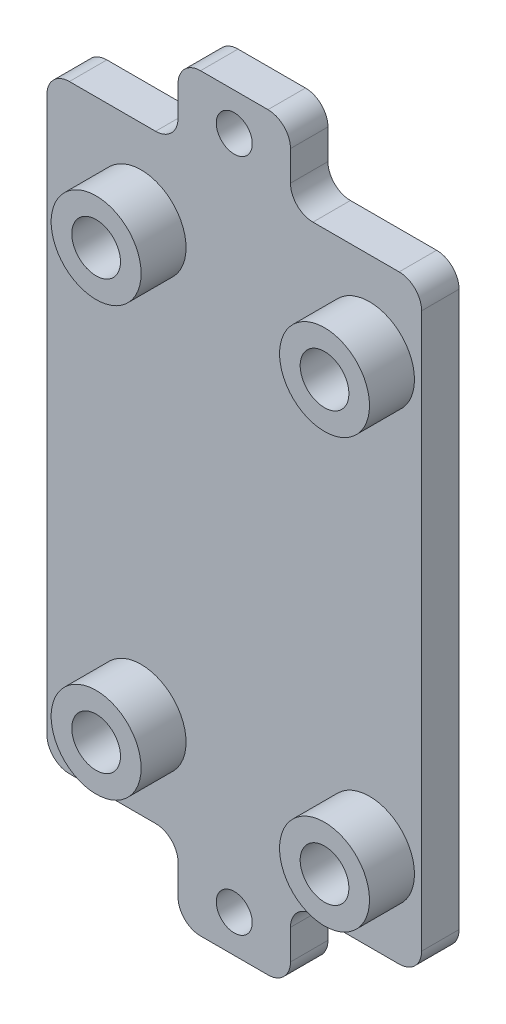
ISO-10303-21;
HEADER;
FILE_DESCRIPTION(('STEP AP214'),'2;1');
FILE_NAME('part.step','',(''),(''),'','','');
FILE_SCHEMA(('AUTOMOTIVE_DESIGN { 1 0 10303 214 1 1 1 1 }'));
ENDSEC;
DATA;
#1=APPLICATION_CONTEXT('core data for automotive mechanical design processes');
#2=APPLICATION_PROTOCOL_DEFINITION('international standard','automotive_design',2000,#1);
#3=PRODUCT_CONTEXT('',#1,'mechanical');
#4=PRODUCT('Part','Part','',(#3));
#5=PRODUCT_RELATED_PRODUCT_CATEGORY('part','',(#4));
#6=PRODUCT_DEFINITION_FORMATION('','',#4);
#7=PRODUCT_DEFINITION_CONTEXT('part definition',#1,'design');
#8=PRODUCT_DEFINITION('design','',#6,#7);
#9=PRODUCT_DEFINITION_SHAPE('','',#8);
#10=(LENGTH_UNIT() NAMED_UNIT(*) SI_UNIT(.MILLI.,.METRE.));
#11=(NAMED_UNIT(*) PLANE_ANGLE_UNIT() SI_UNIT($,.RADIAN.));
#12=(NAMED_UNIT(*) SI_UNIT($,.STERADIAN.) SOLID_ANGLE_UNIT());
#13=UNCERTAINTY_MEASURE_WITH_UNIT(LENGTH_MEASURE(1.E-05),#10,'distance_accuracy_value','');
#14=(GEOMETRIC_REPRESENTATION_CONTEXT(3) GLOBAL_UNCERTAINTY_ASSIGNED_CONTEXT((#13)) GLOBAL_UNIT_ASSIGNED_CONTEXT((#10,
#11,#12)) REPRESENTATION_CONTEXT('',''));
#15=CARTESIAN_POINT('',(0.,0.,0.));
#16=DIRECTION('',(0.,0.,1.));
#17=DIRECTION('',(1.,0.,0.));
#18=AXIS2_PLACEMENT_3D('',#15,#16,#17);
#19=CARTESIAN_POINT('',(-25.,-40.,5.));
#20=DIRECTION('',(0.,1.,0.));
#21=DIRECTION('',(0.,0.,1.));
#22=AXIS2_PLACEMENT_3D('',#19,#20,#21);
#23=PLANE('',#22);
#24=DIRECTION('',(1.,0.,0.));
#25=VECTOR('',#24,1.);
#26=CARTESIAN_POINT('',(-25.,-40.,0.));
#27=LINE('',#26,#25);
#28=CARTESIAN_POINT('',(10.5,-40.,0.));
#29=VERTEX_POINT('',#28);
#30=CARTESIAN_POINT('',(22.,-40.,0.));
#31=VERTEX_POINT('',#30);
#32=EDGE_CURVE('E335',#29,#31,#27,.T.);
#33=ORIENTED_EDGE('',*,*,#32,.T.);
#34=DIRECTION('',(0.,0.,-1.));
#35=VECTOR('',#34,1.);
#36=CARTESIAN_POINT('',(22.,-40.,5.));
#37=LINE('',#36,#35);
#38=CARTESIAN_POINT('',(22.,-40.,5.));
#39=VERTEX_POINT('',#38);
#40=EDGE_CURVE('E63',#31,#39,#37,.F.);
#41=ORIENTED_EDGE('',*,*,#40,.T.);
#42=DIRECTION('',(1.,0.,0.));
#43=VECTOR('',#42,1.);
#44=CARTESIAN_POINT('',(-25.,-40.,5.));
#45=LINE('',#44,#43);
#46=CARTESIAN_POINT('',(10.5,-40.,5.));
#47=VERTEX_POINT('',#46);
#48=EDGE_CURVE('E319',#47,#39,#45,.T.);
#49=ORIENTED_EDGE('',*,*,#48,.F.);
#50=DIRECTION('',(0.,0.,1.));
#51=VECTOR('',#50,1.);
#52=CARTESIAN_POINT('',(10.5,-40.,0.));
#53=LINE('',#52,#51);
#54=EDGE_CURVE('E444',#47,#29,#53,.F.);
#55=ORIENTED_EDGE('',*,*,#54,.T.);
#56=EDGE_LOOP('',(#33,#41,#49,#55));
#57=FACE_BOUND('',#56,.T.);
#58=ADVANCED_FACE('F47',(#57),#23,.F.);
#59=CARTESIAN_POINT('',(-25.,40.,5.));
#60=DIRECTION('',(0.,-1.,0.));
#61=DIRECTION('',(0.,0.,-1.));
#62=AXIS2_PLACEMENT_3D('',#59,#60,#61);
#63=PLANE('',#62);
#64=DIRECTION('',(-1.,0.,0.));
#65=VECTOR('',#64,1.);
#66=CARTESIAN_POINT('',(-25.,40.,5.));
#67=LINE('',#66,#65);
#68=CARTESIAN_POINT('',(-10.5,40.,5.));
#69=VERTEX_POINT('',#68);
#70=CARTESIAN_POINT('',(-22.,40.,5.));
#71=VERTEX_POINT('',#70);
#72=EDGE_CURVE('E309',#69,#71,#67,.T.);
#73=ORIENTED_EDGE('',*,*,#72,.F.);
#74=DIRECTION('',(0.,0.,1.));
#75=VECTOR('',#74,1.);
#76=CARTESIAN_POINT('',(-10.5,40.,0.));
#77=LINE('',#76,#75);
#78=CARTESIAN_POINT('',(-10.5,40.,0.));
#79=VERTEX_POINT('',#78);
#80=EDGE_CURVE('E214',#69,#79,#77,.F.);
#81=ORIENTED_EDGE('',*,*,#80,.T.);
#82=DIRECTION('',(-1.,0.,0.));
#83=VECTOR('',#82,1.);
#84=CARTESIAN_POINT('',(-25.,40.,0.));
#85=LINE('',#84,#83);
#86=CARTESIAN_POINT('',(-22.,40.,0.));
#87=VERTEX_POINT('',#86);
#88=EDGE_CURVE('E326',#79,#87,#85,.T.);
#89=ORIENTED_EDGE('',*,*,#88,.T.);
#90=DIRECTION('',(0.,0.,-1.));
#91=VECTOR('',#90,1.);
#92=CARTESIAN_POINT('',(-22.,40.,5.));
#93=LINE('',#92,#91);
#94=EDGE_CURVE('E231',#87,#71,#93,.F.);
#95=ORIENTED_EDGE('',*,*,#94,.T.);
#96=EDGE_LOOP('',(#73,#81,#89,#95));
#97=FACE_BOUND('',#96,.T.);
#98=ADVANCED_FACE('F531',(#97),#63,.F.);
#99=CARTESIAN_POINT('',(25.,40.,5.));
#100=DIRECTION('',(-1.,0.,0.));
#101=DIRECTION('',(0.,-1.,0.));
#102=AXIS2_PLACEMENT_3D('',#99,#100,#101);
#103=PLANE('',#102);
#104=DIRECTION('',(0.,1.,0.));
#105=VECTOR('',#104,1.);
#106=CARTESIAN_POINT('',(25.,40.,0.));
#107=LINE('',#106,#105);
#108=CARTESIAN_POINT('',(25.,-37.,0.));
#109=VERTEX_POINT('',#108);
#110=CARTESIAN_POINT('',(25.,37.,0.));
#111=VERTEX_POINT('',#110);
#112=EDGE_CURVE('E301',#109,#111,#107,.T.);
#113=ORIENTED_EDGE('',*,*,#112,.T.);
#114=DIRECTION('',(0.,0.,-1.));
#115=VECTOR('',#114,1.);
#116=CARTESIAN_POINT('',(25.,37.,5.));
#117=LINE('',#116,#115);
#118=CARTESIAN_POINT('',(25.,37.,5.));
#119=VERTEX_POINT('',#118);
#120=EDGE_CURVE('E441',#111,#119,#117,.F.);
#121=ORIENTED_EDGE('',*,*,#120,.T.);
#122=DIRECTION('',(0.,1.,0.));
#123=VECTOR('',#122,1.);
#124=CARTESIAN_POINT('',(25.,40.,5.));
#125=LINE('',#124,#123);
#126=CARTESIAN_POINT('',(25.,-37.,5.));
#127=VERTEX_POINT('',#126);
#128=EDGE_CURVE('E305',#127,#119,#125,.T.);
#129=ORIENTED_EDGE('',*,*,#128,.F.);
#130=DIRECTION('',(0.,0.,-1.));
#131=VECTOR('',#130,1.);
#132=CARTESIAN_POINT('',(25.,-37.,5.));
#133=LINE('',#132,#131);
#134=EDGE_CURVE('E437',#127,#109,#133,.T.);
#135=ORIENTED_EDGE('',*,*,#134,.T.);
#136=EDGE_LOOP('',(#113,#121,#129,#135));
#137=FACE_BOUND('',#136,.T.);
#138=ADVANCED_FACE('F608',(#137),#103,.F.);
#139=CARTESIAN_POINT('',(22.,40.,0.));
#140=VERTEX_POINT('',#139);
#141=CARTESIAN_POINT('',(10.5,40.,0.));
#142=VERTEX_POINT('',#141);
#143=EDGE_CURVE('E327',#140,#142,#85,.T.);
#144=ORIENTED_EDGE('',*,*,#143,.T.);
#145=DIRECTION('',(0.,0.,1.));
#146=VECTOR('',#145,1.);
#147=CARTESIAN_POINT('',(10.5,40.,5.));
#148=LINE('',#147,#146);
#149=CARTESIAN_POINT('',(10.5,40.,5.));
#150=VERTEX_POINT('',#149);
#151=EDGE_CURVE('E433',#142,#150,#148,.T.);
#152=ORIENTED_EDGE('',*,*,#151,.T.);
#153=CARTESIAN_POINT('',(22.,40.,5.));
#154=VERTEX_POINT('',#153);
#155=EDGE_CURVE('E311',#154,#150,#67,.T.);
#156=ORIENTED_EDGE('',*,*,#155,.F.);
#157=DIRECTION('',(0.,0.,-1.));
#158=VECTOR('',#157,1.);
#159=CARTESIAN_POINT('',(22.,40.,5.));
#160=LINE('',#159,#158);
#161=EDGE_CURVE('E429',#154,#140,#160,.T.);
#162=ORIENTED_EDGE('',*,*,#161,.T.);
#163=EDGE_LOOP('',(#144,#152,#156,#162));
#164=FACE_BOUND('',#163,.T.);
#165=ADVANCED_FACE('F610',(#164),#63,.F.);
#166=CARTESIAN_POINT('',(-25.,40.,5.));
#167=DIRECTION('',(1.,0.,0.));
#168=DIRECTION('',(0.,0.,-1.));
#169=AXIS2_PLACEMENT_3D('',#166,#167,#168);
#170=PLANE('',#169);
#171=DIRECTION('',(0.,-1.,0.));
#172=VECTOR('',#171,1.);
#173=CARTESIAN_POINT('',(-25.,40.,5.));
#174=LINE('',#173,#172);
#175=CARTESIAN_POINT('',(-25.,37.,5.));
#176=VERTEX_POINT('',#175);
#177=CARTESIAN_POINT('',(-25.,-37.,5.));
#178=VERTEX_POINT('',#177);
#179=EDGE_CURVE('E315',#176,#178,#174,.T.);
#180=ORIENTED_EDGE('',*,*,#179,.F.);
#181=DIRECTION('',(0.,0.,-1.));
#182=VECTOR('',#181,1.);
#183=CARTESIAN_POINT('',(-25.,37.,5.));
#184=LINE('',#183,#182);
#185=CARTESIAN_POINT('',(-25.,37.,0.));
#186=VERTEX_POINT('',#185);
#187=EDGE_CURVE('E364',#176,#186,#184,.T.);
#188=ORIENTED_EDGE('',*,*,#187,.T.);
#189=DIRECTION('',(0.,-1.,0.));
#190=VECTOR('',#189,1.);
#191=CARTESIAN_POINT('',(-25.,40.,0.));
#192=LINE('',#191,#190);
#193=CARTESIAN_POINT('',(-25.,-37.,0.));
#194=VERTEX_POINT('',#193);
#195=EDGE_CURVE('E331',#186,#194,#192,.T.);
#196=ORIENTED_EDGE('',*,*,#195,.T.);
#197=DIRECTION('',(0.,0.,-1.));
#198=VECTOR('',#197,1.);
#199=CARTESIAN_POINT('',(-25.,-37.,5.));
#200=LINE('',#199,#198);
#201=EDGE_CURVE('E361',#194,#178,#200,.F.);
#202=ORIENTED_EDGE('',*,*,#201,.T.);
#203=EDGE_LOOP('',(#180,#188,#196,#202));
#204=FACE_BOUND('',#203,.T.);
#205=ADVANCED_FACE('F522',(#204),#170,.F.);
#206=CARTESIAN_POINT('',(-22.,-40.,0.));
#207=VERTEX_POINT('',#206);
#208=CARTESIAN_POINT('',(-10.5,-40.,0.));
#209=VERTEX_POINT('',#208);
#210=EDGE_CURVE('E310',#207,#209,#27,.T.);
#211=ORIENTED_EDGE('',*,*,#210,.T.);
#212=DIRECTION('',(0.,0.,1.));
#213=VECTOR('',#212,1.);
#214=CARTESIAN_POINT('',(-10.5,-40.,5.));
#215=LINE('',#214,#213);
#216=CARTESIAN_POINT('',(-10.5,-40.,5.));
#217=VERTEX_POINT('',#216);
#218=EDGE_CURVE('E220',#209,#217,#215,.T.);
#219=ORIENTED_EDGE('',*,*,#218,.T.);
#220=CARTESIAN_POINT('',(-22.,-40.,5.));
#221=VERTEX_POINT('',#220);
#222=EDGE_CURVE('E322',#221,#217,#45,.T.);
#223=ORIENTED_EDGE('',*,*,#222,.F.);
#224=DIRECTION('',(0.,0.,-1.));
#225=VECTOR('',#224,1.);
#226=CARTESIAN_POINT('',(-22.,-40.,5.));
#227=LINE('',#226,#225);
#228=EDGE_CURVE('E470',#221,#207,#227,.T.);
#229=ORIENTED_EDGE('',*,*,#228,.T.);
#230=EDGE_LOOP('',(#211,#219,#223,#229));
#231=FACE_BOUND('',#230,.T.);
#232=ADVANCED_FACE('F515',(#231),#23,.F.);
#233=CARTESIAN_POINT('',(0.,0.,5.));
#234=DIRECTION('',(0.,0.,1.));
#235=DIRECTION('',(1.,0.,0.));
#236=AXIS2_PLACEMENT_3D('',#233,#234,#235);
#237=PLANE('',#236);
#238=CARTESIAN_POINT('',(0.,-45.,5.));
#239=DIRECTION('',(0.,0.,1.));
#240=DIRECTION('',(1.,0.,0.));
#241=AXIS2_PLACEMENT_3D('',#238,#239,#240);
#242=CIRCLE('',#241,2.4);
#243=CARTESIAN_POINT('',(2.4,-45.,5.));
#244=VERTEX_POINT('',#243);
#245=EDGE_CURVE('E565',#244,#244,#242,.T.);
#246=ORIENTED_EDGE('',*,*,#245,.F.);
#247=EDGE_LOOP('',(#246));
#248=FACE_BOUND('',#247,.T.);
#249=CARTESIAN_POINT('',(0.,45.,5.));
#250=DIRECTION('',(0.,0.,1.));
#251=DIRECTION('',(1.,0.,0.));
#252=AXIS2_PLACEMENT_3D('',#249,#250,#251);
#253=CIRCLE('',#252,2.4);
#254=CARTESIAN_POINT('',(2.4,45.,5.));
#255=VERTEX_POINT('',#254);
#256=EDGE_CURVE('E247',#255,#255,#253,.T.);
#257=ORIENTED_EDGE('',*,*,#256,.F.);
#258=EDGE_LOOP('',(#257));
#259=FACE_BOUND('',#258,.T.);
#260=CARTESIAN_POINT('',(18.046,28.575,5.));
#261=DIRECTION('',(0.,0.,1.));
#262=DIRECTION('',(1.,0.,0.));
#263=AXIS2_PLACEMENT_3D('',#260,#261,#262);
#264=CIRCLE('',#263,6.);
#265=CARTESIAN_POINT('',(24.046,28.575,5.));
#266=VERTEX_POINT('',#265);
#267=EDGE_CURVE('E261',#266,#266,#264,.T.);
#268=ORIENTED_EDGE('',*,*,#267,.F.);
#269=EDGE_LOOP('',(#268));
#270=FACE_BOUND('',#269,.T.);
#271=CARTESIAN_POINT('',(-12.434,28.575,5.));
#272=DIRECTION('',(0.,0.,1.));
#273=DIRECTION('',(1.,0.,0.));
#274=AXIS2_PLACEMENT_3D('',#271,#272,#273);
#275=CIRCLE('',#274,6.);
#276=CARTESIAN_POINT('',(-6.434,28.575,5.));
#277=VERTEX_POINT('',#276);
#278=EDGE_CURVE('E265',#277,#277,#275,.T.);
#279=ORIENTED_EDGE('',*,*,#278,.F.);
#280=EDGE_LOOP('',(#279));
#281=FACE_BOUND('',#280,.T.);
#282=CARTESIAN_POINT('',(18.046,-28.575,5.));
#283=DIRECTION('',(0.,0.,1.));
#284=DIRECTION('',(1.,0.,0.));
#285=AXIS2_PLACEMENT_3D('',#282,#283,#284);
#286=CIRCLE('',#285,6.);
#287=CARTESIAN_POINT('',(24.046,-28.575,5.));
#288=VERTEX_POINT('',#287);
#289=EDGE_CURVE('E277',#288,#288,#286,.T.);
#290=ORIENTED_EDGE('',*,*,#289,.F.);
#291=EDGE_LOOP('',(#290));
#292=FACE_BOUND('',#291,.T.);
#293=CARTESIAN_POINT('',(-12.434,-28.575,5.));
#294=DIRECTION('',(0.,0.,1.));
#295=DIRECTION('',(1.,0.,0.));
#296=AXIS2_PLACEMENT_3D('',#293,#294,#295);
#297=CIRCLE('',#296,6.);
#298=CARTESIAN_POINT('',(-6.434,-28.575,5.));
#299=VERTEX_POINT('',#298);
#300=EDGE_CURVE('E289',#299,#299,#297,.T.);
#301=ORIENTED_EDGE('',*,*,#300,.F.);
#302=EDGE_LOOP('',(#301));
#303=FACE_BOUND('',#302,.T.);
#304=ORIENTED_EDGE('',*,*,#72,.T.);
#305=CARTESIAN_POINT('',(-22.,37.,5.));
#306=DIRECTION('',(0.,0.,1.));
#307=DIRECTION('',(1.,0.,0.));
#308=AXIS2_PLACEMENT_3D('',#305,#306,#307);
#309=CIRCLE('',#308,3.);
#310=EDGE_CURVE('E412',#71,#176,#309,.T.);
#311=ORIENTED_EDGE('',*,*,#310,.T.);
#312=ORIENTED_EDGE('',*,*,#179,.T.);
#313=CARTESIAN_POINT('',(-22.,-37.,5.));
#314=DIRECTION('',(0.,0.,1.));
#315=DIRECTION('',(1.,0.,0.));
#316=AXIS2_PLACEMENT_3D('',#313,#314,#315);
#317=CIRCLE('',#316,3.);
#318=EDGE_CURVE('E392',#178,#221,#317,.T.);
#319=ORIENTED_EDGE('',*,*,#318,.T.);
#320=ORIENTED_EDGE('',*,*,#222,.T.);
#321=CARTESIAN_POINT('',(-10.5,-43.,5.));
#322=DIRECTION('',(0.,0.,1.));
#323=DIRECTION('',(1.,0.,0.));
#324=AXIS2_PLACEMENT_3D('',#321,#322,#323);
#325=CIRCLE('',#324,3.);
#326=CARTESIAN_POINT('',(-7.5,-43.,5.));
#327=VERTEX_POINT('',#326);
#328=EDGE_CURVE('E56',#217,#327,#325,.F.);
#329=ORIENTED_EDGE('',*,*,#328,.T.);
#330=DIRECTION('',(0.,-1.,0.));
#331=VECTOR('',#330,1.);
#332=CARTESIAN_POINT('',(-7.5,0.,5.));
#333=LINE('',#332,#331);
#334=CARTESIAN_POINT('',(-7.5,-47.,5.));
#335=VERTEX_POINT('',#334);
#336=EDGE_CURVE('E493',#327,#335,#333,.T.);
#337=ORIENTED_EDGE('',*,*,#336,.T.);
#338=CARTESIAN_POINT('',(-4.5,-47.,5.));
#339=DIRECTION('',(0.,0.,1.));
#340=DIRECTION('',(1.,0.,0.));
#341=AXIS2_PLACEMENT_3D('',#338,#339,#340);
#342=CIRCLE('',#341,3.);
#343=CARTESIAN_POINT('',(-4.5,-50.,5.));
#344=VERTEX_POINT('',#343);
#345=EDGE_CURVE('E395',#335,#344,#342,.T.);
#346=ORIENTED_EDGE('',*,*,#345,.T.);
#347=DIRECTION('',(1.,0.,0.));
#348=VECTOR('',#347,1.);
#349=CARTESIAN_POINT('',(0.,-50.,5.));
#350=LINE('',#349,#348);
#351=CARTESIAN_POINT('',(4.5,-50.,5.));
#352=VERTEX_POINT('',#351);
#353=EDGE_CURVE('E504',#344,#352,#350,.T.);
#354=ORIENTED_EDGE('',*,*,#353,.T.);
#355=CARTESIAN_POINT('',(4.5,-47.,5.));
#356=DIRECTION('',(0.,0.,1.));
#357=DIRECTION('',(1.,0.,0.));
#358=AXIS2_PLACEMENT_3D('',#355,#356,#357);
#359=CIRCLE('',#358,3.);
#360=CARTESIAN_POINT('',(7.5,-47.,5.));
#361=VERTEX_POINT('',#360);
#362=EDGE_CURVE('E398',#352,#361,#359,.T.);
#363=ORIENTED_EDGE('',*,*,#362,.T.);
#364=DIRECTION('',(0.,-1.,0.));
#365=VECTOR('',#364,1.);
#366=CARTESIAN_POINT('',(7.50000000000001,0.,5.));
#367=LINE('',#366,#365);
#368=CARTESIAN_POINT('',(7.5,-43.,5.));
#369=VERTEX_POINT('',#368);
#370=EDGE_CURVE('E546',#369,#361,#367,.T.);
#371=ORIENTED_EDGE('',*,*,#370,.F.);
#372=CARTESIAN_POINT('',(10.5,-43.,5.));
#373=DIRECTION('',(0.,0.,1.));
#374=DIRECTION('',(1.,0.,0.));
#375=AXIS2_PLACEMENT_3D('',#372,#373,#374);
#376=CIRCLE('',#375,3.);
#377=EDGE_CURVE('E70',#369,#47,#376,.F.);
#378=ORIENTED_EDGE('',*,*,#377,.T.);
#379=ORIENTED_EDGE('',*,*,#48,.T.);
#380=CARTESIAN_POINT('',(22.,-37.,5.));
#381=DIRECTION('',(0.,0.,1.));
#382=DIRECTION('',(1.,0.,0.));
#383=AXIS2_PLACEMENT_3D('',#380,#381,#382);
#384=CIRCLE('',#383,3.);
#385=EDGE_CURVE('E401',#39,#127,#384,.T.);
#386=ORIENTED_EDGE('',*,*,#385,.T.);
#387=ORIENTED_EDGE('',*,*,#128,.T.);
#388=CARTESIAN_POINT('',(22.,37.,5.));
#389=DIRECTION('',(0.,0.,1.));
#390=DIRECTION('',(1.,0.,0.));
#391=AXIS2_PLACEMENT_3D('',#388,#389,#390);
#392=CIRCLE('',#391,3.);
#393=EDGE_CURVE('E404',#119,#154,#392,.T.);
#394=ORIENTED_EDGE('',*,*,#393,.T.);
#395=ORIENTED_EDGE('',*,*,#155,.T.);
#396=CARTESIAN_POINT('',(10.5,43.,5.));
#397=DIRECTION('',(0.,0.,1.));
#398=DIRECTION('',(1.,0.,0.));
#399=AXIS2_PLACEMENT_3D('',#396,#397,#398);
#400=CIRCLE('',#399,3.);
#401=CARTESIAN_POINT('',(7.5,43.,5.));
#402=VERTEX_POINT('',#401);
#403=EDGE_CURVE('E479',#150,#402,#400,.F.);
#404=ORIENTED_EDGE('',*,*,#403,.T.);
#405=DIRECTION('',(0.,1.,0.));
#406=VECTOR('',#405,1.);
#407=CARTESIAN_POINT('',(7.50000000000001,0.,5.));
#408=LINE('',#407,#406);
#409=CARTESIAN_POINT('',(7.5,47.,5.));
#410=VERTEX_POINT('',#409);
#411=EDGE_CURVE('E238',#402,#410,#408,.T.);
#412=ORIENTED_EDGE('',*,*,#411,.T.);
#413=CARTESIAN_POINT('',(4.5,47.,5.));
#414=DIRECTION('',(0.,0.,1.));
#415=DIRECTION('',(1.,0.,0.));
#416=AXIS2_PLACEMENT_3D('',#413,#414,#415);
#417=CIRCLE('',#416,3.);
#418=CARTESIAN_POINT('',(4.5,50.,5.));
#419=VERTEX_POINT('',#418);
#420=EDGE_CURVE('E407',#410,#419,#417,.T.);
#421=ORIENTED_EDGE('',*,*,#420,.T.);
#422=DIRECTION('',(1.,0.,0.));
#423=VECTOR('',#422,1.);
#424=CARTESIAN_POINT('',(0.,50.,5.));
#425=LINE('',#424,#423);
#426=CARTESIAN_POINT('',(-4.5,50.,5.));
#427=VERTEX_POINT('',#426);
#428=EDGE_CURVE('E244',#427,#419,#425,.T.);
#429=ORIENTED_EDGE('',*,*,#428,.F.);
#430=CARTESIAN_POINT('',(-4.5,47.,5.));
#431=DIRECTION('',(0.,0.,1.));
#432=DIRECTION('',(1.,0.,0.));
#433=AXIS2_PLACEMENT_3D('',#430,#431,#432);
#434=CIRCLE('',#433,3.);
#435=CARTESIAN_POINT('',(-7.5,47.,5.));
#436=VERTEX_POINT('',#435);
#437=EDGE_CURVE('E236',#427,#436,#434,.T.);
#438=ORIENTED_EDGE('',*,*,#437,.T.);
#439=DIRECTION('',(0.,1.,0.));
#440=VECTOR('',#439,1.);
#441=CARTESIAN_POINT('',(-7.5,0.,5.));
#442=LINE('',#441,#440);
#443=CARTESIAN_POINT('',(-7.5,43.,5.));
#444=VERTEX_POINT('',#443);
#445=EDGE_CURVE('E226',#444,#436,#442,.T.);
#446=ORIENTED_EDGE('',*,*,#445,.F.);
#447=CARTESIAN_POINT('',(-10.5,43.,5.));
#448=DIRECTION('',(0.,0.,1.));
#449=DIRECTION('',(1.,0.,0.));
#450=AXIS2_PLACEMENT_3D('',#447,#448,#449);
#451=CIRCLE('',#450,3.);
#452=EDGE_CURVE('E209',#444,#69,#451,.F.);
#453=ORIENTED_EDGE('',*,*,#452,.T.);
#454=EDGE_LOOP('',(#304,#311,#312,#319,#320,#329,#337,#346,#354,#363,#371,#378,#379,#386,#387,
#394,#395,#404,#412,#421,#429,#438,#446,#453));
#455=FACE_BOUND('',#454,.T.);
#456=ADVANCED_FACE('F234',(#248,#259,#270,#281,#292,#303,#455),#237,.T.);
#457=CARTESIAN_POINT('',(0.,0.,0.));
#458=DIRECTION('',(0.,0.,1.));
#459=DIRECTION('',(1.,0.,0.));
#460=AXIS2_PLACEMENT_3D('',#457,#458,#459);
#461=PLANE('',#460);
#462=CARTESIAN_POINT('',(0.,-45.,0.));
#463=DIRECTION('',(0.,0.,1.));
#464=DIRECTION('',(1.,0.,0.));
#465=AXIS2_PLACEMENT_3D('',#462,#463,#464);
#466=CIRCLE('',#465,2.4);
#467=CARTESIAN_POINT('',(2.4,-45.,0.));
#468=VERTEX_POINT('',#467);
#469=EDGE_CURVE('E505',#468,#468,#466,.T.);
#470=ORIENTED_EDGE('',*,*,#469,.T.);
#471=EDGE_LOOP('',(#470));
#472=FACE_BOUND('',#471,.T.);
#473=CARTESIAN_POINT('',(0.,45.,0.));
#474=DIRECTION('',(0.,0.,1.));
#475=DIRECTION('',(1.,0.,0.));
#476=AXIS2_PLACEMENT_3D('',#473,#474,#475);
#477=CIRCLE('',#476,2.4);
#478=CARTESIAN_POINT('',(2.4,45.,0.));
#479=VERTEX_POINT('',#478);
#480=EDGE_CURVE('E239',#479,#479,#477,.T.);
#481=ORIENTED_EDGE('',*,*,#480,.T.);
#482=EDGE_LOOP('',(#481));
#483=FACE_BOUND('',#482,.T.);
#484=ORIENTED_EDGE('',*,*,#195,.F.);
#485=CARTESIAN_POINT('',(-22.,37.,0.));
#486=DIRECTION('',(0.,0.,1.));
#487=DIRECTION('',(1.,0.,0.));
#488=AXIS2_PLACEMENT_3D('',#485,#486,#487);
#489=CIRCLE('',#488,3.);
#490=EDGE_CURVE('E389',#186,#87,#489,.F.);
#491=ORIENTED_EDGE('',*,*,#490,.T.);
#492=ORIENTED_EDGE('',*,*,#88,.F.);
#493=CARTESIAN_POINT('',(-10.5,43.,0.));
#494=DIRECTION('',(0.,0.,1.));
#495=DIRECTION('',(1.,0.,0.));
#496=AXIS2_PLACEMENT_3D('',#493,#494,#495);
#497=CIRCLE('',#496,3.);
#498=CARTESIAN_POINT('',(-7.5,43.,0.));
#499=VERTEX_POINT('',#498);
#500=EDGE_CURVE('E219',#79,#499,#497,.T.);
#501=ORIENTED_EDGE('',*,*,#500,.T.);
#502=DIRECTION('',(0.,1.,0.));
#503=VECTOR('',#502,1.);
#504=CARTESIAN_POINT('',(-7.5,0.,0.));
#505=LINE('',#504,#503);
#506=CARTESIAN_POINT('',(-7.5,47.,0.));
#507=VERTEX_POINT('',#506);
#508=EDGE_CURVE('E229',#499,#507,#505,.T.);
#509=ORIENTED_EDGE('',*,*,#508,.T.);
#510=CARTESIAN_POINT('',(-4.5,47.,0.));
#511=DIRECTION('',(0.,0.,1.));
#512=DIRECTION('',(1.,0.,0.));
#513=AXIS2_PLACEMENT_3D('',#510,#511,#512);
#514=CIRCLE('',#513,3.);
#515=CARTESIAN_POINT('',(-4.5,50.,0.));
#516=VERTEX_POINT('',#515);
#517=EDGE_CURVE('E386',#507,#516,#514,.F.);
#518=ORIENTED_EDGE('',*,*,#517,.T.);
#519=DIRECTION('',(1.,0.,0.));
#520=VECTOR('',#519,1.);
#521=CARTESIAN_POINT('',(0.,50.,0.));
#522=LINE('',#521,#520);
#523=CARTESIAN_POINT('',(4.5,50.,0.));
#524=VERTEX_POINT('',#523);
#525=EDGE_CURVE('E250',#516,#524,#522,.T.);
#526=ORIENTED_EDGE('',*,*,#525,.T.);
#527=CARTESIAN_POINT('',(4.5,47.,0.));
#528=DIRECTION('',(0.,0.,1.));
#529=DIRECTION('',(1.,0.,0.));
#530=AXIS2_PLACEMENT_3D('',#527,#528,#529);
#531=CIRCLE('',#530,3.);
#532=CARTESIAN_POINT('',(7.5,47.,0.));
#533=VERTEX_POINT('',#532);
#534=EDGE_CURVE('E383',#524,#533,#531,.F.);
#535=ORIENTED_EDGE('',*,*,#534,.T.);
#536=DIRECTION('',(0.,1.,0.));
#537=VECTOR('',#536,1.);
#538=CARTESIAN_POINT('',(7.50000000000001,0.,0.));
#539=LINE('',#538,#537);
#540=CARTESIAN_POINT('',(7.5,43.,0.));
#541=VERTEX_POINT('',#540);
#542=EDGE_CURVE('E536',#541,#533,#539,.T.);
#543=ORIENTED_EDGE('',*,*,#542,.F.);
#544=CARTESIAN_POINT('',(10.5,43.,0.));
#545=DIRECTION('',(0.,0.,1.));
#546=DIRECTION('',(1.,0.,0.));
#547=AXIS2_PLACEMENT_3D('',#544,#545,#546);
#548=CIRCLE('',#547,3.);
#549=EDGE_CURVE('E482',#541,#142,#548,.T.);
#550=ORIENTED_EDGE('',*,*,#549,.T.);
#551=ORIENTED_EDGE('',*,*,#143,.F.);
#552=CARTESIAN_POINT('',(22.,37.,0.));
#553=DIRECTION('',(0.,0.,1.));
#554=DIRECTION('',(1.,0.,0.));
#555=AXIS2_PLACEMENT_3D('',#552,#553,#554);
#556=CIRCLE('',#555,3.);
#557=EDGE_CURVE('E380',#140,#111,#556,.F.);
#558=ORIENTED_EDGE('',*,*,#557,.T.);
#559=ORIENTED_EDGE('',*,*,#112,.F.);
#560=CARTESIAN_POINT('',(22.,-37.,0.));
#561=DIRECTION('',(0.,0.,1.));
#562=DIRECTION('',(1.,0.,0.));
#563=AXIS2_PLACEMENT_3D('',#560,#561,#562);
#564=CIRCLE('',#563,3.);
#565=EDGE_CURVE('E377',#109,#31,#564,.F.);
#566=ORIENTED_EDGE('',*,*,#565,.T.);
#567=ORIENTED_EDGE('',*,*,#32,.F.);
#568=CARTESIAN_POINT('',(10.5,-43.,0.));
#569=DIRECTION('',(0.,0.,1.));
#570=DIRECTION('',(1.,0.,0.));
#571=AXIS2_PLACEMENT_3D('',#568,#569,#570);
#572=CIRCLE('',#571,3.);
#573=CARTESIAN_POINT('',(7.5,-43.,0.));
#574=VERTEX_POINT('',#573);
#575=EDGE_CURVE('E487',#29,#574,#572,.T.);
#576=ORIENTED_EDGE('',*,*,#575,.T.);
#577=DIRECTION('',(0.,-1.,0.));
#578=VECTOR('',#577,1.);
#579=CARTESIAN_POINT('',(7.50000000000001,0.,0.));
#580=LINE('',#579,#578);
#581=CARTESIAN_POINT('',(7.5,-47.,0.));
#582=VERTEX_POINT('',#581);
#583=EDGE_CURVE('E545',#574,#582,#580,.T.);
#584=ORIENTED_EDGE('',*,*,#583,.T.);
#585=CARTESIAN_POINT('',(4.5,-47.,0.));
#586=DIRECTION('',(0.,0.,1.));
#587=DIRECTION('',(1.,0.,0.));
#588=AXIS2_PLACEMENT_3D('',#585,#586,#587);
#589=CIRCLE('',#588,3.);
#590=CARTESIAN_POINT('',(4.5,-50.,0.));
#591=VERTEX_POINT('',#590);
#592=EDGE_CURVE('E374',#582,#591,#589,.F.);
#593=ORIENTED_EDGE('',*,*,#592,.T.);
#594=DIRECTION('',(1.,0.,0.));
#595=VECTOR('',#594,1.);
#596=CARTESIAN_POINT('',(0.,-50.,0.));
#597=LINE('',#596,#595);
#598=CARTESIAN_POINT('',(-4.5,-50.,0.));
#599=VERTEX_POINT('',#598);
#600=EDGE_CURVE('E556',#599,#591,#597,.T.);
#601=ORIENTED_EDGE('',*,*,#600,.F.);
#602=CARTESIAN_POINT('',(-4.5,-47.,0.));
#603=DIRECTION('',(0.,0.,1.));
#604=DIRECTION('',(1.,0.,0.));
#605=AXIS2_PLACEMENT_3D('',#602,#603,#604);
#606=CIRCLE('',#605,3.);
#607=CARTESIAN_POINT('',(-7.5,-47.,0.));
#608=VERTEX_POINT('',#607);
#609=EDGE_CURVE('E371',#599,#608,#606,.F.);
#610=ORIENTED_EDGE('',*,*,#609,.T.);
#611=DIRECTION('',(0.,-1.,0.));
#612=VECTOR('',#611,1.);
#613=CARTESIAN_POINT('',(-7.5,0.,0.));
#614=LINE('',#613,#612);
#615=CARTESIAN_POINT('',(-7.5,-43.,0.));
#616=VERTEX_POINT('',#615);
#617=EDGE_CURVE('E513',#616,#608,#614,.T.);
#618=ORIENTED_EDGE('',*,*,#617,.F.);
#619=CARTESIAN_POINT('',(-10.5,-43.,0.));
#620=DIRECTION('',(0.,0.,1.));
#621=DIRECTION('',(1.,0.,0.));
#622=AXIS2_PLACEMENT_3D('',#619,#620,#621);
#623=CIRCLE('',#622,3.);
#624=EDGE_CURVE('E11',#616,#209,#623,.T.);
#625=ORIENTED_EDGE('',*,*,#624,.T.);
#626=ORIENTED_EDGE('',*,*,#210,.F.);
#627=CARTESIAN_POINT('',(-22.,-37.,0.));
#628=DIRECTION('',(0.,0.,1.));
#629=DIRECTION('',(1.,0.,0.));
#630=AXIS2_PLACEMENT_3D('',#627,#628,#629);
#631=CIRCLE('',#630,3.);
#632=EDGE_CURVE('E368',#207,#194,#631,.F.);
#633=ORIENTED_EDGE('',*,*,#632,.T.);
#634=EDGE_LOOP('',(#484,#491,#492,#501,#509,#518,#526,#535,#543,#550,#551,#558,#559,#566,#567,
#576,#584,#593,#601,#610,#618,#625,#626,#633));
#635=FACE_BOUND('',#634,.T.);
#636=ADVANCED_FACE('F512',(#472,#483,#635),#461,.F.);
#637=CARTESIAN_POINT('',(-12.434,-28.575,11.));
#638=DIRECTION('',(0.,0.,-1.));
#639=DIRECTION('',(-1.,0.,0.));
#640=AXIS2_PLACEMENT_3D('',#637,#638,#639);
#641=CYLINDRICAL_SURFACE('',#640,3.25);
#642=CARTESIAN_POINT('',(-12.434,-28.575,11.));
#643=DIRECTION('',(0.,0.,1.));
#644=DIRECTION('',(1.,0.,0.));
#645=AXIS2_PLACEMENT_3D('',#642,#643,#644);
#646=CIRCLE('',#645,3.25);
#647=CARTESIAN_POINT('',(-9.184,-28.575,11.));
#648=VERTEX_POINT('',#647);
#649=EDGE_CURVE('E293',#648,#648,#646,.T.);
#650=ORIENTED_EDGE('',*,*,#649,.T.);
#651=EDGE_LOOP('',(#650));
#652=FACE_BOUND('',#651,.T.);
#653=CARTESIAN_POINT('',(-12.434,-28.575,5.));
#654=DIRECTION('',(0.,0.,1.));
#655=DIRECTION('',(1.,0.,0.));
#656=AXIS2_PLACEMENT_3D('',#653,#654,#655);
#657=CIRCLE('',#656,3.25);
#658=CARTESIAN_POINT('',(-9.184,-28.575,5.));
#659=VERTEX_POINT('',#658);
#660=EDGE_CURVE('E339',#659,#659,#657,.F.);
#661=ORIENTED_EDGE('',*,*,#660,.T.);
#662=EDGE_LOOP('',(#661));
#663=FACE_BOUND('',#662,.T.);
#664=ADVANCED_FACE('F590',(#652,#663),#641,.F.);
#665=CARTESIAN_POINT('',(-12.434,-28.575,11.));
#666=DIRECTION('',(0.,0.,-1.));
#667=DIRECTION('',(-1.,0.,0.));
#668=AXIS2_PLACEMENT_3D('',#665,#666,#667);
#669=CYLINDRICAL_SURFACE('',#668,6.);
#670=CARTESIAN_POINT('',(-12.434,-28.575,11.));
#671=DIRECTION('',(0.,0.,1.));
#672=DIRECTION('',(1.,0.,0.));
#673=AXIS2_PLACEMENT_3D('',#670,#671,#672);
#674=CIRCLE('',#673,6.);
#675=CARTESIAN_POINT('',(-6.434,-28.575,11.));
#676=VERTEX_POINT('',#675);
#677=EDGE_CURVE('E297',#676,#676,#674,.T.);
#678=ORIENTED_EDGE('',*,*,#677,.F.);
#679=EDGE_LOOP('',(#678));
#680=FACE_BOUND('',#679,.T.);
#681=ORIENTED_EDGE('',*,*,#300,.T.);
#682=EDGE_LOOP('',(#681));
#683=FACE_BOUND('',#682,.T.);
#684=ADVANCED_FACE('F587',(#680,#683),#669,.T.);
#685=CARTESIAN_POINT('',(0.,0.,11.));
#686=DIRECTION('',(0.,0.,1.));
#687=DIRECTION('',(1.,0.,0.));
#688=AXIS2_PLACEMENT_3D('',#685,#686,#687);
#689=PLANE('',#688);
#690=ORIENTED_EDGE('',*,*,#649,.F.);
#691=EDGE_LOOP('',(#690));
#692=FACE_BOUND('',#691,.T.);
#693=ORIENTED_EDGE('',*,*,#677,.T.);
#694=EDGE_LOOP('',(#693));
#695=FACE_BOUND('',#694,.T.);
#696=ADVANCED_FACE('F589',(#692,#695),#689,.T.);
#697=ORIENTED_EDGE('',*,*,#660,.F.);
#698=EDGE_LOOP('',(#697));
#699=FACE_BOUND('',#698,.T.);
#700=ADVANCED_FACE('F576',(#699),#237,.T.);
#701=CARTESIAN_POINT('',(18.046,-28.575,11.));
#702=DIRECTION('',(0.,0.,-1.));
#703=DIRECTION('',(-1.,0.,0.));
#704=AXIS2_PLACEMENT_3D('',#701,#702,#703);
#705=CYLINDRICAL_SURFACE('',#704,3.25);
#706=CARTESIAN_POINT('',(18.046,-28.575,11.));
#707=DIRECTION('',(0.,0.,1.));
#708=DIRECTION('',(1.,0.,0.));
#709=AXIS2_PLACEMENT_3D('',#706,#707,#708);
#710=CIRCLE('',#709,3.25);
#711=CARTESIAN_POINT('',(21.296,-28.575,11.));
#712=VERTEX_POINT('',#711);
#713=EDGE_CURVE('E281',#712,#712,#710,.T.);
#714=ORIENTED_EDGE('',*,*,#713,.T.);
#715=EDGE_LOOP('',(#714));
#716=FACE_BOUND('',#715,.T.);
#717=CARTESIAN_POINT('',(18.046,-28.575,5.));
#718=DIRECTION('',(0.,0.,1.));
#719=DIRECTION('',(1.,0.,0.));
#720=AXIS2_PLACEMENT_3D('',#717,#718,#719);
#721=CIRCLE('',#720,3.25);
#722=CARTESIAN_POINT('',(21.296,-28.575,5.));
#723=VERTEX_POINT('',#722);
#724=EDGE_CURVE('E343',#723,#723,#721,.F.);
#725=ORIENTED_EDGE('',*,*,#724,.T.);
#726=EDGE_LOOP('',(#725));
#727=FACE_BOUND('',#726,.T.);
#728=ADVANCED_FACE('F855',(#716,#727),#705,.F.);
#729=CARTESIAN_POINT('',(18.046,-28.575,11.));
#730=DIRECTION('',(0.,0.,-1.));
#731=DIRECTION('',(-1.,0.,0.));
#732=AXIS2_PLACEMENT_3D('',#729,#730,#731);
#733=CYLINDRICAL_SURFACE('',#732,6.);
#734=CARTESIAN_POINT('',(18.046,-28.575,11.));
#735=DIRECTION('',(0.,0.,1.));
#736=DIRECTION('',(1.,0.,0.));
#737=AXIS2_PLACEMENT_3D('',#734,#735,#736);
#738=CIRCLE('',#737,6.);
#739=CARTESIAN_POINT('',(24.046,-28.575,11.));
#740=VERTEX_POINT('',#739);
#741=EDGE_CURVE('E285',#740,#740,#738,.T.);
#742=ORIENTED_EDGE('',*,*,#741,.F.);
#743=EDGE_LOOP('',(#742));
#744=FACE_BOUND('',#743,.T.);
#745=ORIENTED_EDGE('',*,*,#289,.T.);
#746=EDGE_LOOP('',(#745));
#747=FACE_BOUND('',#746,.T.);
#748=ADVANCED_FACE('F915',(#744,#747),#733,.T.);
#749=CARTESIAN_POINT('',(0.,0.,11.));
#750=DIRECTION('',(0.,0.,1.));
#751=DIRECTION('',(1.,0.,0.));
#752=AXIS2_PLACEMENT_3D('',#749,#750,#751);
#753=PLANE('',#752);
#754=ORIENTED_EDGE('',*,*,#713,.F.);
#755=EDGE_LOOP('',(#754));
#756=FACE_BOUND('',#755,.T.);
#757=ORIENTED_EDGE('',*,*,#741,.T.);
#758=EDGE_LOOP('',(#757));
#759=FACE_BOUND('',#758,.T.);
#760=ADVANCED_FACE('F867',(#756,#759),#753,.T.);
#761=ORIENTED_EDGE('',*,*,#724,.F.);
#762=EDGE_LOOP('',(#761));
#763=FACE_BOUND('',#762,.T.);
#764=ADVANCED_FACE('F857',(#763),#237,.T.);
#765=CARTESIAN_POINT('',(-12.434,28.575,11.));
#766=DIRECTION('',(0.,0.,-1.));
#767=DIRECTION('',(-1.,0.,0.));
#768=AXIS2_PLACEMENT_3D('',#765,#766,#767);
#769=CYLINDRICAL_SURFACE('',#768,3.25);
#770=CARTESIAN_POINT('',(-12.434,28.575,11.));
#771=DIRECTION('',(0.,0.,1.));
#772=DIRECTION('',(1.,0.,0.));
#773=AXIS2_PLACEMENT_3D('',#770,#771,#772);
#774=CIRCLE('',#773,3.25);
#775=CARTESIAN_POINT('',(-9.184,28.575,11.));
#776=VERTEX_POINT('',#775);
#777=EDGE_CURVE('E269',#776,#776,#774,.T.);
#778=ORIENTED_EDGE('',*,*,#777,.T.);
#779=EDGE_LOOP('',(#778));
#780=FACE_BOUND('',#779,.T.);
#781=CARTESIAN_POINT('',(-12.434,28.575,5.));
#782=DIRECTION('',(0.,0.,1.));
#783=DIRECTION('',(1.,0.,0.));
#784=AXIS2_PLACEMENT_3D('',#781,#782,#783);
#785=CIRCLE('',#784,3.25);
#786=CARTESIAN_POINT('',(-9.184,28.575,5.));
#787=VERTEX_POINT('',#786);
#788=EDGE_CURVE('E347',#787,#787,#785,.F.);
#789=ORIENTED_EDGE('',*,*,#788,.T.);
#790=EDGE_LOOP('',(#789));
#791=FACE_BOUND('',#790,.T.);
#792=ADVANCED_FACE('F866',(#780,#791),#769,.F.);
#793=CARTESIAN_POINT('',(-12.434,28.575,11.));
#794=DIRECTION('',(0.,0.,-1.));
#795=DIRECTION('',(-1.,0.,0.));
#796=AXIS2_PLACEMENT_3D('',#793,#794,#795);
#797=CYLINDRICAL_SURFACE('',#796,6.);
#798=CARTESIAN_POINT('',(-12.434,28.575,11.));
#799=DIRECTION('',(0.,0.,1.));
#800=DIRECTION('',(1.,0.,0.));
#801=AXIS2_PLACEMENT_3D('',#798,#799,#800);
#802=CIRCLE('',#801,6.);
#803=CARTESIAN_POINT('',(-6.434,28.575,11.));
#804=VERTEX_POINT('',#803);
#805=EDGE_CURVE('E273',#804,#804,#802,.T.);
#806=ORIENTED_EDGE('',*,*,#805,.F.);
#807=EDGE_LOOP('',(#806));
#808=FACE_BOUND('',#807,.T.);
#809=ORIENTED_EDGE('',*,*,#278,.T.);
#810=EDGE_LOOP('',(#809));
#811=FACE_BOUND('',#810,.T.);
#812=ADVANCED_FACE('F941',(#808,#811),#797,.T.);
#813=CARTESIAN_POINT('',(0.,0.,11.));
#814=DIRECTION('',(0.,0.,1.));
#815=DIRECTION('',(1.,0.,0.));
#816=AXIS2_PLACEMENT_3D('',#813,#814,#815);
#817=PLANE('',#816);
#818=ORIENTED_EDGE('',*,*,#777,.F.);
#819=EDGE_LOOP('',(#818));
#820=FACE_BOUND('',#819,.T.);
#821=ORIENTED_EDGE('',*,*,#805,.T.);
#822=EDGE_LOOP('',(#821));
#823=FACE_BOUND('',#822,.T.);
#824=ADVANCED_FACE('F880',(#820,#823),#817,.T.);
#825=ORIENTED_EDGE('',*,*,#788,.F.);
#826=EDGE_LOOP('',(#825));
#827=FACE_BOUND('',#826,.T.);
#828=ADVANCED_FACE('F869',(#827),#237,.T.);
#829=CARTESIAN_POINT('',(18.046,28.575,11.));
#830=DIRECTION('',(0.,0.,-1.));
#831=DIRECTION('',(-1.,0.,0.));
#832=AXIS2_PLACEMENT_3D('',#829,#830,#831);
#833=CYLINDRICAL_SURFACE('',#832,3.25);
#834=CARTESIAN_POINT('',(18.046,28.575,11.));
#835=DIRECTION('',(0.,0.,1.));
#836=DIRECTION('',(1.,0.,0.));
#837=AXIS2_PLACEMENT_3D('',#834,#835,#836);
#838=CIRCLE('',#837,3.25);
#839=CARTESIAN_POINT('',(21.296,28.575,11.));
#840=VERTEX_POINT('',#839);
#841=EDGE_CURVE('E256',#840,#840,#838,.T.);
#842=ORIENTED_EDGE('',*,*,#841,.T.);
#843=EDGE_LOOP('',(#842));
#844=FACE_BOUND('',#843,.T.);
#845=CARTESIAN_POINT('',(18.046,28.575,5.));
#846=DIRECTION('',(0.,0.,1.));
#847=DIRECTION('',(1.,0.,0.));
#848=AXIS2_PLACEMENT_3D('',#845,#846,#847);
#849=CIRCLE('',#848,3.25);
#850=CARTESIAN_POINT('',(21.296,28.575,5.));
#851=VERTEX_POINT('',#850);
#852=EDGE_CURVE('E351',#851,#851,#849,.F.);
#853=ORIENTED_EDGE('',*,*,#852,.T.);
#854=EDGE_LOOP('',(#853));
#855=FACE_BOUND('',#854,.T.);
#856=ADVANCED_FACE('F879',(#844,#855),#833,.F.);
#857=CARTESIAN_POINT('',(18.046,28.575,11.));
#858=DIRECTION('',(0.,0.,-1.));
#859=DIRECTION('',(-1.,0.,0.));
#860=AXIS2_PLACEMENT_3D('',#857,#858,#859);
#861=CYLINDRICAL_SURFACE('',#860,6.);
#862=CARTESIAN_POINT('',(18.046,28.575,11.));
#863=DIRECTION('',(0.,0.,1.));
#864=DIRECTION('',(1.,0.,0.));
#865=AXIS2_PLACEMENT_3D('',#862,#863,#864);
#866=CIRCLE('',#865,6.);
#867=CARTESIAN_POINT('',(24.046,28.575,11.));
#868=VERTEX_POINT('',#867);
#869=EDGE_CURVE('E260',#868,#868,#866,.T.);
#870=ORIENTED_EDGE('',*,*,#869,.F.);
#871=EDGE_LOOP('',(#870));
#872=FACE_BOUND('',#871,.T.);
#873=ORIENTED_EDGE('',*,*,#267,.T.);
#874=EDGE_LOOP('',(#873));
#875=FACE_BOUND('',#874,.T.);
#876=ADVANCED_FACE('F967',(#872,#875),#861,.T.);
#877=CARTESIAN_POINT('',(0.,0.,11.));
#878=DIRECTION('',(0.,0.,1.));
#879=DIRECTION('',(1.,0.,0.));
#880=AXIS2_PLACEMENT_3D('',#877,#878,#879);
#881=PLANE('',#880);
#882=ORIENTED_EDGE('',*,*,#841,.F.);
#883=EDGE_LOOP('',(#882));
#884=FACE_BOUND('',#883,.T.);
#885=ORIENTED_EDGE('',*,*,#869,.T.);
#886=EDGE_LOOP('',(#885));
#887=FACE_BOUND('',#886,.T.);
#888=ADVANCED_FACE('F890',(#884,#887),#881,.T.);
#889=ORIENTED_EDGE('',*,*,#852,.F.);
#890=EDGE_LOOP('',(#889));
#891=FACE_BOUND('',#890,.T.);
#892=ADVANCED_FACE('F575',(#891),#237,.T.);
#893=CARTESIAN_POINT('',(-7.5,0.,0.));
#894=DIRECTION('',(1.,0.,0.));
#895=DIRECTION('',(0.,0.,-1.));
#896=AXIS2_PLACEMENT_3D('',#893,#894,#895);
#897=PLANE('',#896);
#898=ORIENTED_EDGE('',*,*,#508,.F.);
#899=DIRECTION('',(0.,0.,1.));
#900=VECTOR('',#899,1.);
#901=CARTESIAN_POINT('',(-7.5,43.,5.));
#902=LINE('',#901,#900);
#903=EDGE_CURVE('E213',#499,#444,#902,.T.);
#904=ORIENTED_EDGE('',*,*,#903,.T.);
#905=ORIENTED_EDGE('',*,*,#445,.T.);
#906=DIRECTION('',(0.,0.,1.));
#907=VECTOR('',#906,1.);
#908=CARTESIAN_POINT('',(-7.5,47.,0.));
#909=LINE('',#908,#907);
#910=EDGE_CURVE('E232',#436,#507,#909,.F.);
#911=ORIENTED_EDGE('',*,*,#910,.T.);
#912=EDGE_LOOP('',(#898,#904,#905,#911));
#913=FACE_BOUND('',#912,.T.);
#914=ADVANCED_FACE('F225',(#913),#897,.F.);
#915=CARTESIAN_POINT('',(0.,50.,0.));
#916=DIRECTION('',(0.,-1.,0.));
#917=DIRECTION('',(0.,0.,-1.));
#918=AXIS2_PLACEMENT_3D('',#915,#916,#917);
#919=PLANE('',#918);
#920=ORIENTED_EDGE('',*,*,#525,.F.);
#921=DIRECTION('',(0.,0.,1.));
#922=VECTOR('',#921,1.);
#923=CARTESIAN_POINT('',(-4.5,50.,0.));
#924=LINE('',#923,#922);
#925=EDGE_CURVE('E418',#516,#427,#924,.T.);
#926=ORIENTED_EDGE('',*,*,#925,.T.);
#927=ORIENTED_EDGE('',*,*,#428,.T.);
#928=DIRECTION('',(0.,0.,1.));
#929=VECTOR('',#928,1.);
#930=CARTESIAN_POINT('',(4.5,50.,0.));
#931=LINE('',#930,#929);
#932=EDGE_CURVE('E415',#419,#524,#931,.F.);
#933=ORIENTED_EDGE('',*,*,#932,.T.);
#934=EDGE_LOOP('',(#920,#926,#927,#933));
#935=FACE_BOUND('',#934,.T.);
#936=ADVANCED_FACE('F790',(#935),#919,.F.);
#937=CARTESIAN_POINT('',(7.50000000000001,0.,0.));
#938=DIRECTION('',(1.,0.,0.));
#939=DIRECTION('',(0.,1.,0.));
#940=AXIS2_PLACEMENT_3D('',#937,#938,#939);
#941=PLANE('',#940);
#942=ORIENTED_EDGE('',*,*,#542,.T.);
#943=DIRECTION('',(0.,0.,1.));
#944=VECTOR('',#943,1.);
#945=CARTESIAN_POINT('',(7.5,47.,5.));
#946=LINE('',#945,#944);
#947=EDGE_CURVE('E425',#533,#410,#946,.T.);
#948=ORIENTED_EDGE('',*,*,#947,.T.);
#949=ORIENTED_EDGE('',*,*,#411,.F.);
#950=DIRECTION('',(0.,0.,1.));
#951=VECTOR('',#950,1.);
#952=CARTESIAN_POINT('',(7.5,43.,0.));
#953=LINE('',#952,#951);
#954=EDGE_CURVE('E422',#402,#541,#953,.F.);
#955=ORIENTED_EDGE('',*,*,#954,.T.);
#956=EDGE_LOOP('',(#942,#948,#949,#955));
#957=FACE_BOUND('',#956,.T.);
#958=ADVANCED_FACE('F797',(#957),#941,.T.);
#959=CARTESIAN_POINT('',(0.,45.,5.));
#960=DIRECTION('',(0.,0.,1.));
#961=DIRECTION('',(1.,0.,0.));
#962=AXIS2_PLACEMENT_3D('',#959,#960,#961);
#963=CYLINDRICAL_SURFACE('',#962,2.4);
#964=ORIENTED_EDGE('',*,*,#480,.F.);
#965=EDGE_LOOP('',(#964));
#966=FACE_BOUND('',#965,.T.);
#967=ORIENTED_EDGE('',*,*,#256,.T.);
#968=EDGE_LOOP('',(#967));
#969=FACE_BOUND('',#968,.T.);
#970=ADVANCED_FACE('F769',(#966,#969),#963,.F.);
#971=CARTESIAN_POINT('',(-7.5,0.,0.));
#972=DIRECTION('',(-1.,0.,0.));
#973=DIRECTION('',(0.,0.,1.));
#974=AXIS2_PLACEMENT_3D('',#971,#972,#973);
#975=PLANE('',#974);
#976=ORIENTED_EDGE('',*,*,#617,.T.);
#977=DIRECTION('',(0.,0.,1.));
#978=VECTOR('',#977,1.);
#979=CARTESIAN_POINT('',(-7.5,-47.,0.));
#980=LINE('',#979,#978);
#981=EDGE_CURVE('E466',#608,#335,#980,.T.);
#982=ORIENTED_EDGE('',*,*,#981,.T.);
#983=ORIENTED_EDGE('',*,*,#336,.F.);
#984=DIRECTION('',(0.,0.,1.));
#985=VECTOR('',#984,1.);
#986=CARTESIAN_POINT('',(-7.5,-43.,0.));
#987=LINE('',#986,#985);
#988=EDGE_CURVE('E463',#327,#616,#987,.F.);
#989=ORIENTED_EDGE('',*,*,#988,.T.);
#990=EDGE_LOOP('',(#976,#982,#983,#989));
#991=FACE_BOUND('',#990,.T.);
#992=ADVANCED_FACE('F500',(#991),#975,.T.);
#993=CARTESIAN_POINT('',(7.50000000000001,0.,0.));
#994=DIRECTION('',(-1.,0.,0.));
#995=DIRECTION('',(0.,-1.,0.));
#996=AXIS2_PLACEMENT_3D('',#993,#994,#995);
#997=PLANE('',#996);
#998=ORIENTED_EDGE('',*,*,#583,.F.);
#999=DIRECTION('',(0.,0.,1.));
#1000=VECTOR('',#999,1.);
#1001=CARTESIAN_POINT('',(7.5,-43.,5.));
#1002=LINE('',#1001,#1000);
#1003=EDGE_CURVE('E452',#574,#369,#1002,.T.);
#1004=ORIENTED_EDGE('',*,*,#1003,.T.);
#1005=ORIENTED_EDGE('',*,*,#370,.T.);
#1006=DIRECTION('',(0.,0.,1.));
#1007=VECTOR('',#1006,1.);
#1008=CARTESIAN_POINT('',(7.5,-47.,0.));
#1009=LINE('',#1008,#1007);
#1010=EDGE_CURVE('E449',#361,#582,#1009,.F.);
#1011=ORIENTED_EDGE('',*,*,#1010,.T.);
#1012=EDGE_LOOP('',(#998,#1004,#1005,#1011));
#1013=FACE_BOUND('',#1012,.T.);
#1014=ADVANCED_FACE('F750',(#1013),#997,.F.);
#1015=CARTESIAN_POINT('',(0.,-50.,0.));
#1016=DIRECTION('',(0.,-1.,0.));
#1017=DIRECTION('',(0.,0.,-1.));
#1018=AXIS2_PLACEMENT_3D('',#1015,#1016,#1017);
#1019=PLANE('',#1018);
#1020=ORIENTED_EDGE('',*,*,#600,.T.);
#1021=DIRECTION('',(0.,0.,1.));
#1022=VECTOR('',#1021,1.);
#1023=CARTESIAN_POINT('',(4.5,-50.,5.));
#1024=LINE('',#1023,#1022);
#1025=EDGE_CURVE('E459',#591,#352,#1024,.T.);
#1026=ORIENTED_EDGE('',*,*,#1025,.T.);
#1027=ORIENTED_EDGE('',*,*,#353,.F.);
#1028=DIRECTION('',(0.,0.,1.));
#1029=VECTOR('',#1028,1.);
#1030=CARTESIAN_POINT('',(-4.5,-50.,0.));
#1031=LINE('',#1030,#1029);
#1032=EDGE_CURVE('E456',#344,#599,#1031,.F.);
#1033=ORIENTED_EDGE('',*,*,#1032,.T.);
#1034=EDGE_LOOP('',(#1020,#1026,#1027,#1033));
#1035=FACE_BOUND('',#1034,.T.);
#1036=ADVANCED_FACE('F740',(#1035),#1019,.T.);
#1037=CARTESIAN_POINT('',(0.,-45.,5.));
#1038=DIRECTION('',(0.,0.,1.));
#1039=DIRECTION('',(1.,0.,0.));
#1040=AXIS2_PLACEMENT_3D('',#1037,#1038,#1039);
#1041=CYLINDRICAL_SURFACE('',#1040,2.4);
#1042=ORIENTED_EDGE('',*,*,#469,.F.);
#1043=EDGE_LOOP('',(#1042));
#1044=FACE_BOUND('',#1043,.T.);
#1045=ORIENTED_EDGE('',*,*,#245,.T.);
#1046=EDGE_LOOP('',(#1045));
#1047=FACE_BOUND('',#1046,.T.);
#1048=ADVANCED_FACE('F570',(#1044,#1047),#1041,.F.);
#1049=CARTESIAN_POINT('',(-10.5,43.,0.));
#1050=DIRECTION('',(0.,0.,-1.));
#1051=DIRECTION('',(-1.,0.,0.));
#1052=AXIS2_PLACEMENT_3D('',#1049,#1050,#1051);
#1053=CYLINDRICAL_SURFACE('',#1052,3.);
#1054=ORIENTED_EDGE('',*,*,#500,.F.);
#1055=ORIENTED_EDGE('',*,*,#80,.F.);
#1056=ORIENTED_EDGE('',*,*,#452,.F.);
#1057=ORIENTED_EDGE('',*,*,#903,.F.);
#1058=EDGE_LOOP('',(#1054,#1055,#1056,#1057));
#1059=FACE_BOUND('',#1058,.T.);
#1060=ADVANCED_FACE('F212',(#1059),#1053,.F.);
#1061=CARTESIAN_POINT('',(-22.,37.,5.));
#1062=DIRECTION('',(0.,0.,-1.));
#1063=DIRECTION('',(-1.,0.,0.));
#1064=AXIS2_PLACEMENT_3D('',#1061,#1062,#1063);
#1065=CYLINDRICAL_SURFACE('',#1064,3.);
#1066=ORIENTED_EDGE('',*,*,#310,.F.);
#1067=ORIENTED_EDGE('',*,*,#94,.F.);
#1068=ORIENTED_EDGE('',*,*,#490,.F.);
#1069=ORIENTED_EDGE('',*,*,#187,.F.);
#1070=EDGE_LOOP('',(#1066,#1067,#1068,#1069));
#1071=FACE_BOUND('',#1070,.T.);
#1072=ADVANCED_FACE('F526',(#1071),#1065,.T.);
#1073=CARTESIAN_POINT('',(-4.5,47.,0.));
#1074=DIRECTION('',(0.,0.,1.));
#1075=DIRECTION('',(1.,0.,0.));
#1076=AXIS2_PLACEMENT_3D('',#1073,#1074,#1075);
#1077=CYLINDRICAL_SURFACE('',#1076,3.);
#1078=ORIENTED_EDGE('',*,*,#517,.F.);
#1079=ORIENTED_EDGE('',*,*,#910,.F.);
#1080=ORIENTED_EDGE('',*,*,#437,.F.);
#1081=ORIENTED_EDGE('',*,*,#925,.F.);
#1082=EDGE_LOOP('',(#1078,#1079,#1080,#1081));
#1083=FACE_BOUND('',#1082,.T.);
#1084=ADVANCED_FACE('F629',(#1083),#1077,.T.);
#1085=CARTESIAN_POINT('',(4.5,47.,0.));
#1086=DIRECTION('',(0.,0.,-1.));
#1087=DIRECTION('',(-1.,0.,0.));
#1088=AXIS2_PLACEMENT_3D('',#1085,#1086,#1087);
#1089=CYLINDRICAL_SURFACE('',#1088,3.);
#1090=ORIENTED_EDGE('',*,*,#534,.F.);
#1091=ORIENTED_EDGE('',*,*,#932,.F.);
#1092=ORIENTED_EDGE('',*,*,#420,.F.);
#1093=ORIENTED_EDGE('',*,*,#947,.F.);
#1094=EDGE_LOOP('',(#1090,#1091,#1092,#1093));
#1095=FACE_BOUND('',#1094,.T.);
#1096=ADVANCED_FACE('F632',(#1095),#1089,.T.);
#1097=CARTESIAN_POINT('',(10.5,43.,5.));
#1098=DIRECTION('',(0.,0.,1.));
#1099=DIRECTION('',(1.,0.,0.));
#1100=AXIS2_PLACEMENT_3D('',#1097,#1098,#1099);
#1101=CYLINDRICAL_SURFACE('',#1100,3.);
#1102=ORIENTED_EDGE('',*,*,#549,.F.);
#1103=ORIENTED_EDGE('',*,*,#954,.F.);
#1104=ORIENTED_EDGE('',*,*,#403,.F.);
#1105=ORIENTED_EDGE('',*,*,#151,.F.);
#1106=EDGE_LOOP('',(#1102,#1103,#1104,#1105));
#1107=FACE_BOUND('',#1106,.T.);
#1108=ADVANCED_FACE('F636',(#1107),#1101,.F.);
#1109=CARTESIAN_POINT('',(22.,37.,5.));
#1110=DIRECTION('',(0.,0.,-1.));
#1111=DIRECTION('',(-1.,0.,0.));
#1112=AXIS2_PLACEMENT_3D('',#1109,#1110,#1111);
#1113=CYLINDRICAL_SURFACE('',#1112,3.);
#1114=ORIENTED_EDGE('',*,*,#393,.F.);
#1115=ORIENTED_EDGE('',*,*,#120,.F.);
#1116=ORIENTED_EDGE('',*,*,#557,.F.);
#1117=ORIENTED_EDGE('',*,*,#161,.F.);
#1118=EDGE_LOOP('',(#1114,#1115,#1116,#1117));
#1119=FACE_BOUND('',#1118,.T.);
#1120=ADVANCED_FACE('F640',(#1119),#1113,.T.);
#1121=CARTESIAN_POINT('',(22.,-37.,5.));
#1122=DIRECTION('',(0.,0.,-1.));
#1123=DIRECTION('',(-1.,0.,0.));
#1124=AXIS2_PLACEMENT_3D('',#1121,#1122,#1123);
#1125=CYLINDRICAL_SURFACE('',#1124,3.);
#1126=ORIENTED_EDGE('',*,*,#385,.F.);
#1127=ORIENTED_EDGE('',*,*,#40,.F.);
#1128=ORIENTED_EDGE('',*,*,#565,.F.);
#1129=ORIENTED_EDGE('',*,*,#134,.F.);
#1130=EDGE_LOOP('',(#1126,#1127,#1128,#1129));
#1131=FACE_BOUND('',#1130,.T.);
#1132=ADVANCED_FACE('F644',(#1131),#1125,.T.);
#1133=CARTESIAN_POINT('',(10.5,-43.,0.));
#1134=DIRECTION('',(0.,0.,-1.));
#1135=DIRECTION('',(-1.,0.,0.));
#1136=AXIS2_PLACEMENT_3D('',#1133,#1134,#1135);
#1137=CYLINDRICAL_SURFACE('',#1136,3.);
#1138=ORIENTED_EDGE('',*,*,#575,.F.);
#1139=ORIENTED_EDGE('',*,*,#54,.F.);
#1140=ORIENTED_EDGE('',*,*,#377,.F.);
#1141=ORIENTED_EDGE('',*,*,#1003,.F.);
#1142=EDGE_LOOP('',(#1138,#1139,#1140,#1141));
#1143=FACE_BOUND('',#1142,.T.);
#1144=ADVANCED_FACE('F648',(#1143),#1137,.F.);
#1145=CARTESIAN_POINT('',(4.5,-47.,0.));
#1146=DIRECTION('',(0.,0.,-1.));
#1147=DIRECTION('',(-1.,0.,0.));
#1148=AXIS2_PLACEMENT_3D('',#1145,#1146,#1147);
#1149=CYLINDRICAL_SURFACE('',#1148,3.);
#1150=ORIENTED_EDGE('',*,*,#592,.F.);
#1151=ORIENTED_EDGE('',*,*,#1010,.F.);
#1152=ORIENTED_EDGE('',*,*,#362,.F.);
#1153=ORIENTED_EDGE('',*,*,#1025,.F.);
#1154=EDGE_LOOP('',(#1150,#1151,#1152,#1153));
#1155=FACE_BOUND('',#1154,.T.);
#1156=ADVANCED_FACE('F652',(#1155),#1149,.T.);
#1157=CARTESIAN_POINT('',(-4.5,-47.,0.));
#1158=DIRECTION('',(0.,0.,1.));
#1159=DIRECTION('',(1.,0.,0.));
#1160=AXIS2_PLACEMENT_3D('',#1157,#1158,#1159);
#1161=CYLINDRICAL_SURFACE('',#1160,3.);
#1162=ORIENTED_EDGE('',*,*,#609,.F.);
#1163=ORIENTED_EDGE('',*,*,#1032,.F.);
#1164=ORIENTED_EDGE('',*,*,#345,.F.);
#1165=ORIENTED_EDGE('',*,*,#981,.F.);
#1166=EDGE_LOOP('',(#1162,#1163,#1164,#1165));
#1167=FACE_BOUND('',#1166,.T.);
#1168=ADVANCED_FACE('F656',(#1167),#1161,.T.);
#1169=CARTESIAN_POINT('',(-10.5,-43.,5.));
#1170=DIRECTION('',(0.,0.,1.));
#1171=DIRECTION('',(1.,0.,0.));
#1172=AXIS2_PLACEMENT_3D('',#1169,#1170,#1171);
#1173=CYLINDRICAL_SURFACE('',#1172,3.);
#1174=ORIENTED_EDGE('',*,*,#624,.F.);
#1175=ORIENTED_EDGE('',*,*,#988,.F.);
#1176=ORIENTED_EDGE('',*,*,#328,.F.);
#1177=ORIENTED_EDGE('',*,*,#218,.F.);
#1178=EDGE_LOOP('',(#1174,#1175,#1176,#1177));
#1179=FACE_BOUND('',#1178,.T.);
#1180=ADVANCED_FACE('F508',(#1179),#1173,.F.);
#1181=CARTESIAN_POINT('',(-22.,-37.,5.));
#1182=DIRECTION('',(0.,0.,-1.));
#1183=DIRECTION('',(-1.,0.,0.));
#1184=AXIS2_PLACEMENT_3D('',#1181,#1182,#1183);
#1185=CYLINDRICAL_SURFACE('',#1184,3.);
#1186=ORIENTED_EDGE('',*,*,#318,.F.);
#1187=ORIENTED_EDGE('',*,*,#201,.F.);
#1188=ORIENTED_EDGE('',*,*,#632,.F.);
#1189=ORIENTED_EDGE('',*,*,#228,.F.);
#1190=EDGE_LOOP('',(#1186,#1187,#1188,#1189));
#1191=FACE_BOUND('',#1190,.T.);
#1192=ADVANCED_FACE('F49',(#1191),#1185,.T.);
#1193=CLOSED_SHELL('',(#58,#98,#138,#165,#205,#232,#456,#636,#664,#684,#696,#700,#728,#748,#760,
#764,#792,#812,#824,#828,#856,#876,#888,#892,#914,#936,#958,#970,#992,#1014,#1036,#1048,#1060,
#1072,#1084,#1096,#1108,#1120,#1132,#1144,#1156,#1168,#1180,#1192));
#1194=MANIFOLD_SOLID_BREP('B2',#1193);
#1195=ADVANCED_BREP_SHAPE_REPRESENTATION('',(#18,#1194),#14);
#1196=SHAPE_DEFINITION_REPRESENTATION(#9,#1195);
ENDSEC;
END-ISO-10303-21;
